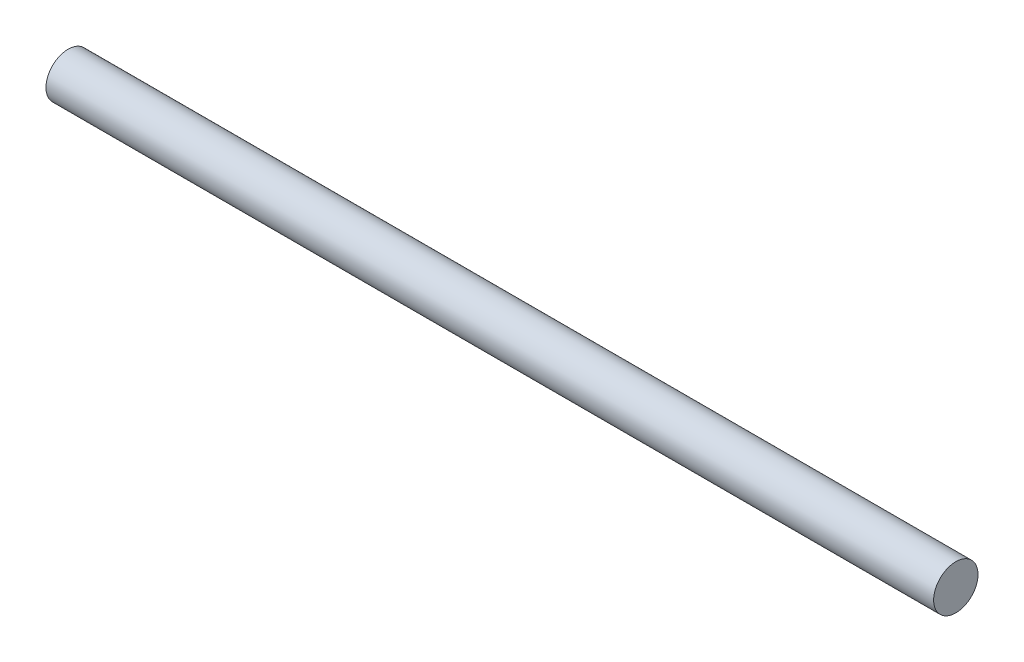
ISO-10303-21;
HEADER;
FILE_DESCRIPTION(('STEP AP214'),'2;1');
FILE_NAME('part.step','',(''),(''),'','','');
FILE_SCHEMA(('AUTOMOTIVE_DESIGN { 1 0 10303 214 1 1 1 1 }'));
ENDSEC;
DATA;
#1=APPLICATION_CONTEXT('core data for automotive mechanical design processes');
#2=APPLICATION_PROTOCOL_DEFINITION('international standard','automotive_design',2000,#1);
#3=PRODUCT_CONTEXT('',#1,'mechanical');
#4=PRODUCT('Part','Part','',(#3));
#5=PRODUCT_RELATED_PRODUCT_CATEGORY('part','',(#4));
#6=PRODUCT_DEFINITION_FORMATION('','',#4);
#7=PRODUCT_DEFINITION_CONTEXT('part definition',#1,'design');
#8=PRODUCT_DEFINITION('design','',#6,#7);
#9=PRODUCT_DEFINITION_SHAPE('','',#8);
#10=(LENGTH_UNIT() NAMED_UNIT(*) SI_UNIT(.MILLI.,.METRE.));
#11=(NAMED_UNIT(*) PLANE_ANGLE_UNIT() SI_UNIT($,.RADIAN.));
#12=(NAMED_UNIT(*) SI_UNIT($,.STERADIAN.) SOLID_ANGLE_UNIT());
#13=UNCERTAINTY_MEASURE_WITH_UNIT(LENGTH_MEASURE(1.E-05),#10,'distance_accuracy_value','');
#14=(GEOMETRIC_REPRESENTATION_CONTEXT(3) GLOBAL_UNCERTAINTY_ASSIGNED_CONTEXT((#13)) GLOBAL_UNIT_ASSIGNED_CONTEXT((#10,
#11,#12)) REPRESENTATION_CONTEXT('',''));
#15=CARTESIAN_POINT('',(0.,0.,0.));
#16=DIRECTION('',(0.,0.,1.));
#17=DIRECTION('',(1.,0.,0.));
#18=AXIS2_PLACEMENT_3D('',#15,#16,#17);
#19=CARTESIAN_POINT('',(20.,0.,0.));
#20=DIRECTION('',(-1.,0.,0.));
#21=DIRECTION('',(0.,0.,1.));
#22=AXIS2_PLACEMENT_3D('',#19,#20,#21);
#23=CYLINDRICAL_SURFACE('',#22,1.);
#24=CARTESIAN_POINT('',(20.,0.,0.));
#25=DIRECTION('',(1.,0.,0.));
#26=DIRECTION('',(0.,0.,-1.));
#27=AXIS2_PLACEMENT_3D('',#24,#25,#26);
#28=CIRCLE('',#27,1.);
#29=CARTESIAN_POINT('',(20.,0.,-1.));
#30=VERTEX_POINT('',#29);
#31=EDGE_CURVE('E11',#30,#30,#28,.T.);
#32=ORIENTED_EDGE('',*,*,#31,.F.);
#33=EDGE_LOOP('',(#32));
#34=FACE_BOUND('',#33,.T.);
#35=CARTESIAN_POINT('',(-20.,0.,0.));
#36=DIRECTION('',(1.,0.,0.));
#37=DIRECTION('',(0.,0.,-1.));
#38=AXIS2_PLACEMENT_3D('',#35,#36,#37);
#39=CIRCLE('',#38,1.);
#40=CARTESIAN_POINT('',(-20.,0.,-1.));
#41=VERTEX_POINT('',#40);
#42=EDGE_CURVE('E46',#41,#41,#39,.T.);
#43=ORIENTED_EDGE('',*,*,#42,.T.);
#44=EDGE_LOOP('',(#43));
#45=FACE_BOUND('',#44,.T.);
#46=ADVANCED_FACE('F42',(#34,#45),#23,.T.);
#47=CARTESIAN_POINT('',(20.,0.,0.));
#48=DIRECTION('',(1.,0.,0.));
#49=DIRECTION('',(0.,0.,-1.));
#50=AXIS2_PLACEMENT_3D('',#47,#48,#49);
#51=PLANE('',#50);
#52=ORIENTED_EDGE('',*,*,#31,.T.);
#53=EDGE_LOOP('',(#52));
#54=FACE_BOUND('',#53,.T.);
#55=ADVANCED_FACE('F64',(#54),#51,.T.);
#56=CARTESIAN_POINT('',(-20.,0.,0.));
#57=DIRECTION('',(1.,0.,0.));
#58=DIRECTION('',(0.,0.,-1.));
#59=AXIS2_PLACEMENT_3D('',#56,#57,#58);
#60=PLANE('',#59);
#61=ORIENTED_EDGE('',*,*,#42,.F.);
#62=EDGE_LOOP('',(#61));
#63=FACE_BOUND('',#62,.T.);
#64=ADVANCED_FACE('F62',(#63),#60,.F.);
#65=CLOSED_SHELL('',(#46,#55,#64));
#66=MANIFOLD_SOLID_BREP('B2',#65);
#67=ADVANCED_BREP_SHAPE_REPRESENTATION('',(#18,#66),#14);
#68=SHAPE_DEFINITION_REPRESENTATION(#9,#67);
ENDSEC;
END-ISO-10303-21;
